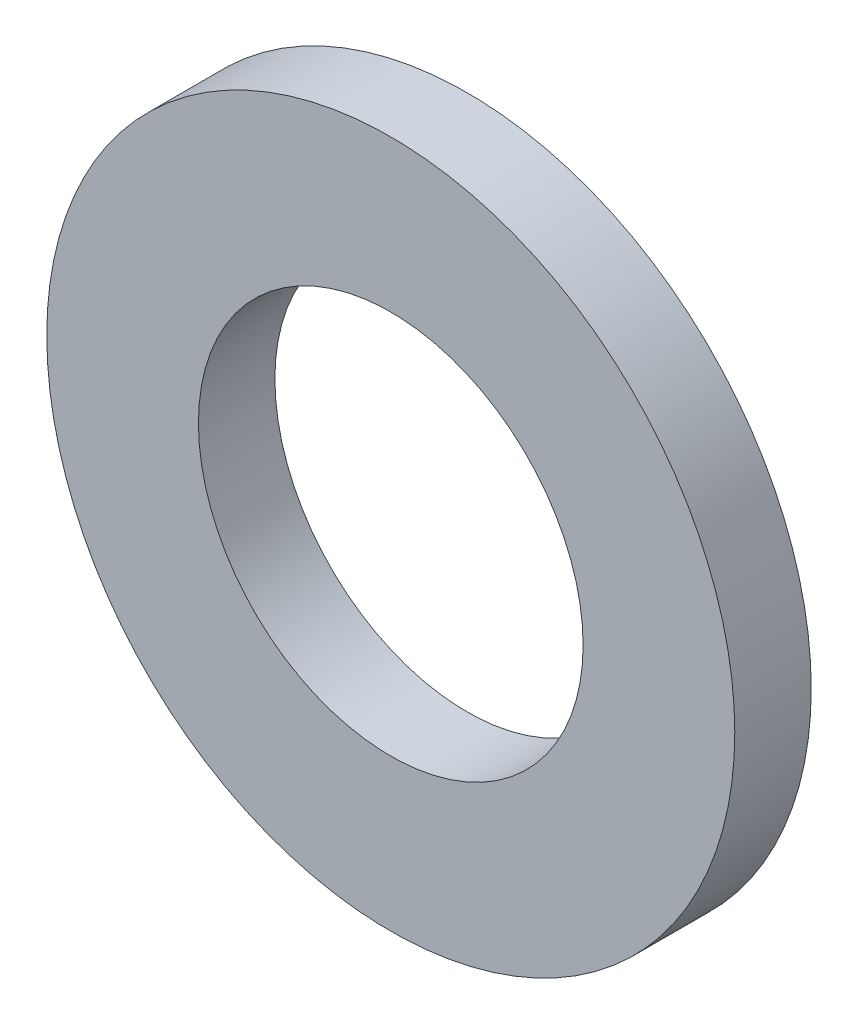
ISO-10303-21;
HEADER;
FILE_DESCRIPTION(('STEP AP214'),'2;1');
FILE_NAME('part.step','',(''),(''),'','','');
FILE_SCHEMA(('AUTOMOTIVE_DESIGN { 1 0 10303 214 1 1 1 1 }'));
ENDSEC;
DATA;
#1=APPLICATION_CONTEXT('core data for automotive mechanical design processes');
#2=APPLICATION_PROTOCOL_DEFINITION('international standard','automotive_design',2000,#1);
#3=PRODUCT_CONTEXT('',#1,'mechanical');
#4=PRODUCT('Part','Part','',(#3));
#5=PRODUCT_RELATED_PRODUCT_CATEGORY('part','',(#4));
#6=PRODUCT_DEFINITION_FORMATION('','',#4);
#7=PRODUCT_DEFINITION_CONTEXT('part definition',#1,'design');
#8=PRODUCT_DEFINITION('design','',#6,#7);
#9=PRODUCT_DEFINITION_SHAPE('','',#8);
#10=(LENGTH_UNIT() NAMED_UNIT(*) SI_UNIT(.MILLI.,.METRE.));
#11=(NAMED_UNIT(*) PLANE_ANGLE_UNIT() SI_UNIT($,.RADIAN.));
#12=(NAMED_UNIT(*) SI_UNIT($,.STERADIAN.) SOLID_ANGLE_UNIT());
#13=UNCERTAINTY_MEASURE_WITH_UNIT(LENGTH_MEASURE(1.E-05),#10,'distance_accuracy_value','');
#14=(GEOMETRIC_REPRESENTATION_CONTEXT(3) GLOBAL_UNCERTAINTY_ASSIGNED_CONTEXT((#13)) GLOBAL_UNIT_ASSIGNED_CONTEXT((#10,
#11,#12)) REPRESENTATION_CONTEXT('',''));
#15=CARTESIAN_POINT('',(0.,0.,0.));
#16=DIRECTION('',(0.,0.,1.));
#17=DIRECTION('',(1.,0.,0.));
#18=AXIS2_PLACEMENT_3D('',#15,#16,#17);
#19=CARTESIAN_POINT('',(0.,0.,0.));
#20=DIRECTION('',(0.,0.,1.));
#21=DIRECTION('',(1.,0.,0.));
#22=AXIS2_PLACEMENT_3D('',#19,#20,#21);
#23=PLANE('',#22);
#24=CARTESIAN_POINT('',(0.,0.,0.));
#25=DIRECTION('',(0.,0.,-1.));
#26=DIRECTION('',(-1.,0.,0.));
#27=AXIS2_PLACEMENT_3D('',#24,#25,#26);
#28=CIRCLE('',#27,7.9883);
#29=CARTESIAN_POINT('',(-7.9883,0.,0.));
#30=VERTEX_POINT('',#29);
#31=EDGE_CURVE('E27',#30,#30,#28,.F.);
#32=ORIENTED_EDGE('',*,*,#31,.T.);
#33=EDGE_LOOP('',(#32));
#34=FACE_BOUND('',#33,.T.);
#35=CARTESIAN_POINT('',(0.,0.,0.));
#36=DIRECTION('',(0.,0.,-1.));
#37=DIRECTION('',(-1.,0.,0.));
#38=AXIS2_PLACEMENT_3D('',#35,#36,#37);
#39=CIRCLE('',#38,14.2875);
#40=CARTESIAN_POINT('',(-14.2875,0.,0.));
#41=VERTEX_POINT('',#40);
#42=EDGE_CURVE('E18',#41,#41,#39,.F.);
#43=ORIENTED_EDGE('',*,*,#42,.F.);
#44=EDGE_LOOP('',(#43));
#45=FACE_BOUND('',#44,.T.);
#46=ADVANCED_FACE('F15',(#34,#45),#23,.F.);
#47=CARTESIAN_POINT('',(0.,0.,3.175));
#48=DIRECTION('',(0.,0.,-1.));
#49=DIRECTION('',(-1.,0.,0.));
#50=AXIS2_PLACEMENT_3D('',#47,#48,#49);
#51=CYLINDRICAL_SURFACE('',#50,14.2875);
#52=ORIENTED_EDGE('',*,*,#42,.T.);
#53=EDGE_LOOP('',(#52));
#54=FACE_BOUND('',#53,.T.);
#55=CARTESIAN_POINT('',(0.,0.,3.175));
#56=DIRECTION('',(0.,0.,-1.));
#57=DIRECTION('',(-1.,0.,0.));
#58=AXIS2_PLACEMENT_3D('',#55,#56,#57);
#59=CIRCLE('',#58,14.2875);
#60=CARTESIAN_POINT('',(-14.2875,0.,3.175));
#61=VERTEX_POINT('',#60);
#62=EDGE_CURVE('E22',#61,#61,#59,.F.);
#63=ORIENTED_EDGE('',*,*,#62,.F.);
#64=EDGE_LOOP('',(#63));
#65=FACE_BOUND('',#64,.T.);
#66=ADVANCED_FACE('F35',(#54,#65),#51,.T.);
#67=CARTESIAN_POINT('',(0.,0.,3.175));
#68=DIRECTION('',(0.,0.,-1.));
#69=DIRECTION('',(-1.,0.,0.));
#70=AXIS2_PLACEMENT_3D('',#67,#68,#69);
#71=CYLINDRICAL_SURFACE('',#70,7.9883);
#72=CARTESIAN_POINT('',(0.,0.,3.175));
#73=DIRECTION('',(0.,0.,-1.));
#74=DIRECTION('',(-1.,0.,0.));
#75=AXIS2_PLACEMENT_3D('',#72,#73,#74);
#76=CIRCLE('',#75,7.9883);
#77=CARTESIAN_POINT('',(-7.9883,0.,3.175));
#78=VERTEX_POINT('',#77);
#79=EDGE_CURVE('E10',#78,#78,#76,.T.);
#80=ORIENTED_EDGE('',*,*,#79,.F.);
#81=EDGE_LOOP('',(#80));
#82=FACE_BOUND('',#81,.T.);
#83=ORIENTED_EDGE('',*,*,#31,.F.);
#84=EDGE_LOOP('',(#83));
#85=FACE_BOUND('',#84,.T.);
#86=ADVANCED_FACE('F43',(#82,#85),#71,.F.);
#87=CARTESIAN_POINT('',(0.,0.,3.175));
#88=DIRECTION('',(0.,0.,1.));
#89=DIRECTION('',(1.,0.,0.));
#90=AXIS2_PLACEMENT_3D('',#87,#88,#89);
#91=PLANE('',#90);
#92=ORIENTED_EDGE('',*,*,#79,.T.);
#93=EDGE_LOOP('',(#92));
#94=FACE_BOUND('',#93,.T.);
#95=ORIENTED_EDGE('',*,*,#62,.T.);
#96=EDGE_LOOP('',(#95));
#97=FACE_BOUND('',#96,.T.);
#98=ADVANCED_FACE('F44',(#94,#97),#91,.T.);
#99=CLOSED_SHELL('',(#46,#66,#86,#98));
#100=MANIFOLD_SOLID_BREP('B1',#99);
#101=ADVANCED_BREP_SHAPE_REPRESENTATION('',(#18,#100),#14);
#102=SHAPE_DEFINITION_REPRESENTATION(#9,#101);
ENDSEC;
END-ISO-10303-21;
